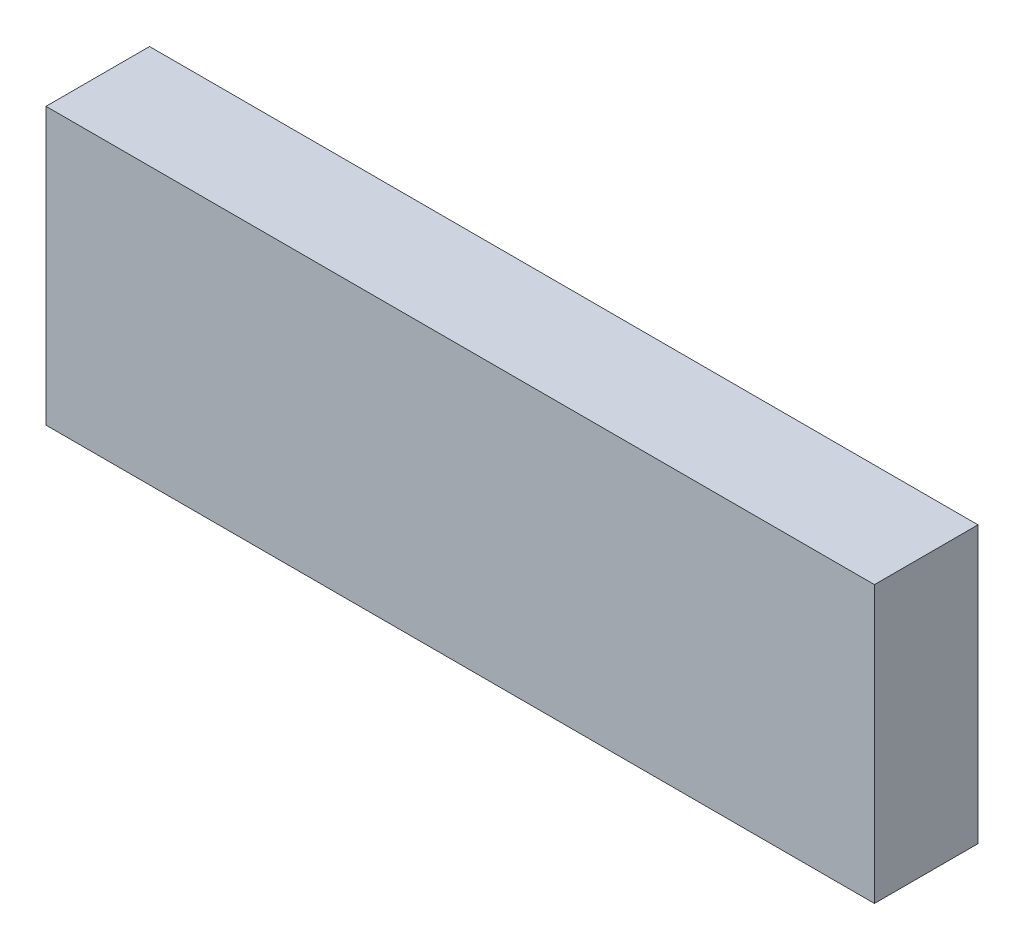
ISO-10303-21;
HEADER;
FILE_DESCRIPTION(('STEP AP214'),'2;1');
FILE_NAME('part.step','',(''),(''),'','','');
FILE_SCHEMA(('AUTOMOTIVE_DESIGN { 1 0 10303 214 1 1 1 1 }'));
ENDSEC;
DATA;
#1=APPLICATION_CONTEXT('core data for automotive mechanical design processes');
#2=APPLICATION_PROTOCOL_DEFINITION('international standard','automotive_design',2000,#1);
#3=PRODUCT_CONTEXT('',#1,'mechanical');
#4=PRODUCT('Part','Part','',(#3));
#5=PRODUCT_RELATED_PRODUCT_CATEGORY('part','',(#4));
#6=PRODUCT_DEFINITION_FORMATION('','',#4);
#7=PRODUCT_DEFINITION_CONTEXT('part definition',#1,'design');
#8=PRODUCT_DEFINITION('design','',#6,#7);
#9=PRODUCT_DEFINITION_SHAPE('','',#8);
#10=(LENGTH_UNIT() NAMED_UNIT(*) SI_UNIT(.MILLI.,.METRE.));
#11=(NAMED_UNIT(*) PLANE_ANGLE_UNIT() SI_UNIT($,.RADIAN.));
#12=(NAMED_UNIT(*) SI_UNIT($,.STERADIAN.) SOLID_ANGLE_UNIT());
#13=UNCERTAINTY_MEASURE_WITH_UNIT(LENGTH_MEASURE(1.E-05),#10,'distance_accuracy_value','');
#14=(GEOMETRIC_REPRESENTATION_CONTEXT(3) GLOBAL_UNCERTAINTY_ASSIGNED_CONTEXT((#13)) GLOBAL_UNIT_ASSIGNED_CONTEXT((#10,
#11,#12)) REPRESENTATION_CONTEXT('',''));
#15=CARTESIAN_POINT('',(0.,0.,0.));
#16=DIRECTION('',(0.,0.,1.));
#17=DIRECTION('',(1.,0.,0.));
#18=AXIS2_PLACEMENT_3D('',#15,#16,#17);
#19=CARTESIAN_POINT('',(0.,0.,150.));
#20=DIRECTION('',(1.,0.,0.));
#21=DIRECTION('',(0.,0.,-1.));
#22=AXIS2_PLACEMENT_3D('',#19,#20,#21);
#23=PLANE('',#22);
#24=DIRECTION('',(0.,-1.,0.));
#25=VECTOR('',#24,1.);
#26=CARTESIAN_POINT('',(0.,0.,0.));
#27=LINE('',#26,#25);
#28=CARTESIAN_POINT('',(0.,400.,0.));
#29=VERTEX_POINT('',#28);
#30=CARTESIAN_POINT('',(0.,0.,0.));
#31=VERTEX_POINT('',#30);
#32=EDGE_CURVE('E109',#29,#31,#27,.T.);
#33=ORIENTED_EDGE('',*,*,#32,.T.);
#34=DIRECTION('',(0.,0.,-1.));
#35=VECTOR('',#34,1.);
#36=CARTESIAN_POINT('',(0.,0.,150.));
#37=LINE('',#36,#35);
#38=CARTESIAN_POINT('',(0.,0.,150.));
#39=VERTEX_POINT('',#38);
#40=EDGE_CURVE('E11',#39,#31,#37,.T.);
#41=ORIENTED_EDGE('',*,*,#40,.F.);
#42=DIRECTION('',(0.,-1.,0.));
#43=VECTOR('',#42,1.);
#44=CARTESIAN_POINT('',(0.,0.,150.));
#45=LINE('',#44,#43);
#46=CARTESIAN_POINT('',(0.,400.,150.));
#47=VERTEX_POINT('',#46);
#48=EDGE_CURVE('E92',#47,#39,#45,.T.);
#49=ORIENTED_EDGE('',*,*,#48,.F.);
#50=DIRECTION('',(0.,0.,-1.));
#51=VECTOR('',#50,1.);
#52=CARTESIAN_POINT('',(0.,400.,150.));
#53=LINE('',#52,#51);
#54=EDGE_CURVE('E105',#47,#29,#53,.T.);
#55=ORIENTED_EDGE('',*,*,#54,.T.);
#56=EDGE_LOOP('',(#33,#41,#49,#55));
#57=FACE_BOUND('',#56,.T.);
#58=ADVANCED_FACE('F40',(#57),#23,.F.);
#59=CARTESIAN_POINT('',(0.,0.,150.));
#60=DIRECTION('',(0.,1.,0.));
#61=DIRECTION('',(0.,0.,1.));
#62=AXIS2_PLACEMENT_3D('',#59,#60,#61);
#63=PLANE('',#62);
#64=DIRECTION('',(1.,0.,0.));
#65=VECTOR('',#64,1.);
#66=CARTESIAN_POINT('',(0.,0.,0.));
#67=LINE('',#66,#65);
#68=CARTESIAN_POINT('',(1200.,0.,0.));
#69=VERTEX_POINT('',#68);
#70=EDGE_CURVE('E97',#31,#69,#67,.T.);
#71=ORIENTED_EDGE('',*,*,#70,.T.);
#72=DIRECTION('',(0.,0.,-1.));
#73=VECTOR('',#72,1.);
#74=CARTESIAN_POINT('',(1200.,0.,150.));
#75=LINE('',#74,#73);
#76=CARTESIAN_POINT('',(1200.,0.,150.));
#77=VERTEX_POINT('',#76);
#78=EDGE_CURVE('E49',#77,#69,#75,.T.);
#79=ORIENTED_EDGE('',*,*,#78,.F.);
#80=DIRECTION('',(1.,0.,0.));
#81=VECTOR('',#80,1.);
#82=CARTESIAN_POINT('',(0.,0.,150.));
#83=LINE('',#82,#81);
#84=EDGE_CURVE('E87',#39,#77,#83,.T.);
#85=ORIENTED_EDGE('',*,*,#84,.F.);
#86=ORIENTED_EDGE('',*,*,#40,.T.);
#87=EDGE_LOOP('',(#71,#79,#85,#86));
#88=FACE_BOUND('',#87,.T.);
#89=ADVANCED_FACE('F96',(#88),#63,.F.);
#90=CARTESIAN_POINT('',(1200.,0.,150.));
#91=DIRECTION('',(-1.,0.,0.));
#92=DIRECTION('',(0.,0.,1.));
#93=AXIS2_PLACEMENT_3D('',#90,#91,#92);
#94=PLANE('',#93);
#95=DIRECTION('',(0.,1.,0.));
#96=VECTOR('',#95,1.);
#97=CARTESIAN_POINT('',(1200.,0.,0.));
#98=LINE('',#97,#96);
#99=CARTESIAN_POINT('',(1200.,400.,0.));
#100=VERTEX_POINT('',#99);
#101=EDGE_CURVE('E74',#69,#100,#98,.T.);
#102=ORIENTED_EDGE('',*,*,#101,.T.);
#103=DIRECTION('',(0.,0.,-1.));
#104=VECTOR('',#103,1.);
#105=CARTESIAN_POINT('',(1200.,400.,150.));
#106=LINE('',#105,#104);
#107=CARTESIAN_POINT('',(1200.,400.,150.));
#108=VERTEX_POINT('',#107);
#109=EDGE_CURVE('E99',#108,#100,#106,.T.);
#110=ORIENTED_EDGE('',*,*,#109,.F.);
#111=DIRECTION('',(0.,1.,0.));
#112=VECTOR('',#111,1.);
#113=CARTESIAN_POINT('',(1200.,0.,150.));
#114=LINE('',#113,#112);
#115=EDGE_CURVE('E90',#77,#108,#114,.T.);
#116=ORIENTED_EDGE('',*,*,#115,.F.);
#117=ORIENTED_EDGE('',*,*,#78,.T.);
#118=EDGE_LOOP('',(#102,#110,#116,#117));
#119=FACE_BOUND('',#118,.T.);
#120=ADVANCED_FACE('F100',(#119),#94,.F.);
#121=CARTESIAN_POINT('',(0.,400.,150.));
#122=DIRECTION('',(0.,-1.,0.));
#123=DIRECTION('',(0.,0.,-1.));
#124=AXIS2_PLACEMENT_3D('',#121,#122,#123);
#125=PLANE('',#124);
#126=DIRECTION('',(-1.,0.,0.));
#127=VECTOR('',#126,1.);
#128=CARTESIAN_POINT('',(0.,400.,0.));
#129=LINE('',#128,#127);
#130=EDGE_CURVE('E80',#100,#29,#129,.T.);
#131=ORIENTED_EDGE('',*,*,#130,.T.);
#132=ORIENTED_EDGE('',*,*,#54,.F.);
#133=DIRECTION('',(-1.,0.,0.));
#134=VECTOR('',#133,1.);
#135=CARTESIAN_POINT('',(0.,400.,150.));
#136=LINE('',#135,#134);
#137=EDGE_CURVE('E57',#108,#47,#136,.T.);
#138=ORIENTED_EDGE('',*,*,#137,.F.);
#139=ORIENTED_EDGE('',*,*,#109,.T.);
#140=EDGE_LOOP('',(#131,#132,#138,#139));
#141=FACE_BOUND('',#140,.T.);
#142=ADVANCED_FACE('F123',(#141),#125,.F.);
#143=CARTESIAN_POINT('',(0.,0.,150.));
#144=DIRECTION('',(0.,0.,-1.));
#145=DIRECTION('',(-1.,0.,0.));
#146=AXIS2_PLACEMENT_3D('',#143,#144,#145);
#147=PLANE('',#146);
#148=ORIENTED_EDGE('',*,*,#48,.T.);
#149=ORIENTED_EDGE('',*,*,#84,.T.);
#150=ORIENTED_EDGE('',*,*,#115,.T.);
#151=ORIENTED_EDGE('',*,*,#137,.T.);
#152=EDGE_LOOP('',(#148,#149,#150,#151));
#153=FACE_BOUND('',#152,.T.);
#154=ADVANCED_FACE('F88',(#153),#147,.F.);
#155=CARTESIAN_POINT('',(0.,0.,0.));
#156=DIRECTION('',(0.,0.,-1.));
#157=DIRECTION('',(-1.,0.,0.));
#158=AXIS2_PLACEMENT_3D('',#155,#156,#157);
#159=PLANE('',#158);
#160=ORIENTED_EDGE('',*,*,#32,.F.);
#161=ORIENTED_EDGE('',*,*,#130,.F.);
#162=ORIENTED_EDGE('',*,*,#101,.F.);
#163=ORIENTED_EDGE('',*,*,#70,.F.);
#164=EDGE_LOOP('',(#160,#161,#162,#163));
#165=FACE_BOUND('',#164,.T.);
#166=ADVANCED_FACE('F126',(#165),#159,.T.);
#167=CLOSED_SHELL('',(#58,#89,#120,#142,#154,#166));
#168=MANIFOLD_SOLID_BREP('B2',#167);
#169=ADVANCED_BREP_SHAPE_REPRESENTATION('',(#18,#168),#14);
#170=SHAPE_DEFINITION_REPRESENTATION(#9,#169);
ENDSEC;
END-ISO-10303-21;
